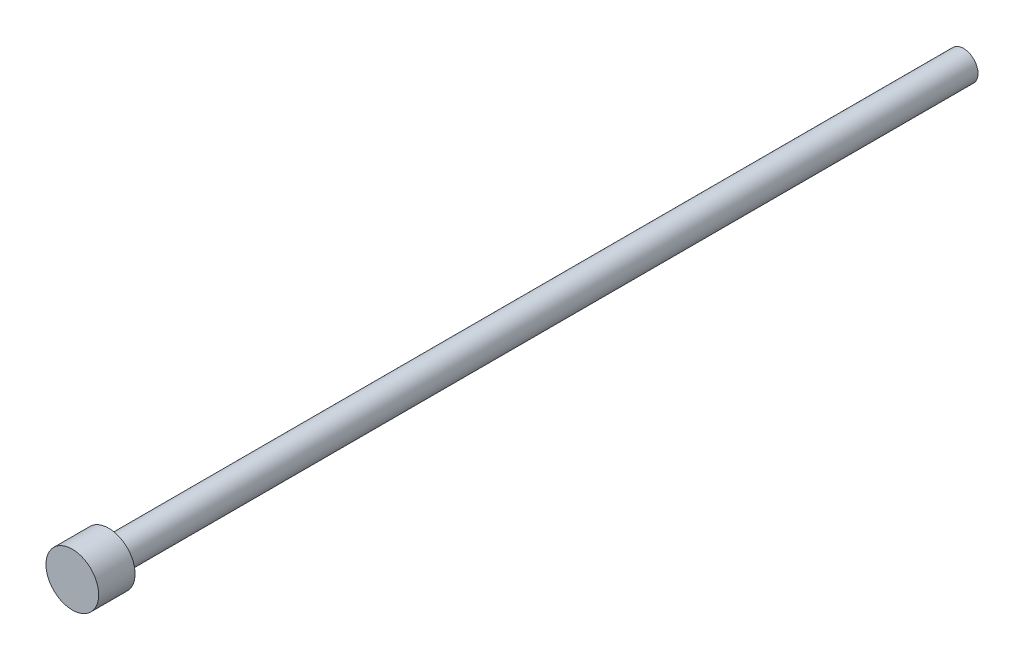
ISO-10303-21;
HEADER;
FILE_DESCRIPTION(('STEP AP214'),'2;1');
FILE_NAME('part.step','',(''),(''),'','','');
FILE_SCHEMA(('AUTOMOTIVE_DESIGN { 1 0 10303 214 1 1 1 1 }'));
ENDSEC;
DATA;
#1=APPLICATION_CONTEXT('core data for automotive mechanical design processes');
#2=APPLICATION_PROTOCOL_DEFINITION('international standard','automotive_design',2000,#1);
#3=PRODUCT_CONTEXT('',#1,'mechanical');
#4=PRODUCT('Part','Part','',(#3));
#5=PRODUCT_RELATED_PRODUCT_CATEGORY('part','',(#4));
#6=PRODUCT_DEFINITION_FORMATION('','',#4);
#7=PRODUCT_DEFINITION_CONTEXT('part definition',#1,'design');
#8=PRODUCT_DEFINITION('design','',#6,#7);
#9=PRODUCT_DEFINITION_SHAPE('','',#8);
#10=(LENGTH_UNIT() NAMED_UNIT(*) SI_UNIT(.MILLI.,.METRE.));
#11=(NAMED_UNIT(*) PLANE_ANGLE_UNIT() SI_UNIT($,.RADIAN.));
#12=(NAMED_UNIT(*) SI_UNIT($,.STERADIAN.) SOLID_ANGLE_UNIT());
#13=UNCERTAINTY_MEASURE_WITH_UNIT(LENGTH_MEASURE(1.E-05),#10,'distance_accuracy_value','');
#14=(GEOMETRIC_REPRESENTATION_CONTEXT(3) GLOBAL_UNCERTAINTY_ASSIGNED_CONTEXT((#13)) GLOBAL_UNIT_ASSIGNED_CONTEXT((#10,
#11,#12)) REPRESENTATION_CONTEXT('',''));
#15=CARTESIAN_POINT('',(0.,0.,0.));
#16=DIRECTION('',(0.,0.,1.));
#17=DIRECTION('',(1.,0.,0.));
#18=AXIS2_PLACEMENT_3D('',#15,#16,#17);
#19=CARTESIAN_POINT('',(0.,0.,119.38));
#20=DIRECTION('',(0.,0.,-1.));
#21=DIRECTION('',(-1.,0.,0.));
#22=AXIS2_PLACEMENT_3D('',#19,#20,#21);
#23=CYLINDRICAL_SURFACE('',#22,2.03835);
#24=CARTESIAN_POINT('',(0.,0.,119.38));
#25=DIRECTION('',(0.,0.,1.));
#26=DIRECTION('',(1.,0.,0.));
#27=AXIS2_PLACEMENT_3D('',#24,#25,#26);
#28=CIRCLE('',#27,2.03835);
#29=CARTESIAN_POINT('',(-2.03835,0.,119.38));
#30=VERTEX_POINT('',#29);
#31=EDGE_CURVE('E10',#30,#30,#28,.T.);
#32=CARTESIAN_POINT('',(0.,0.,0.));
#33=DIRECTION('',(0.,0.,1.));
#34=DIRECTION('',(1.,0.,0.));
#35=AXIS2_PLACEMENT_3D('',#32,#33,#34);
#36=CIRCLE('',#35,2.03835);
#37=CARTESIAN_POINT('',(-2.03835,0.,0.));
#38=VERTEX_POINT('',#37);
#39=EDGE_CURVE('E38',#38,#38,#36,.T.);
#40=CARTESIAN_POINT('',(-2.03835,0.,119.38));
#41=CARTESIAN_POINT('',(-2.03835,0.,118.136458333333));
#42=CARTESIAN_POINT('',(-2.03835,0.,116.892916666667));
#43=CARTESIAN_POINT('',(-2.03835,0.,114.405833333333));
#44=CARTESIAN_POINT('',(-2.03835,0.,113.162291666667));
#45=CARTESIAN_POINT('',(-2.03835,0.,110.675208333333));
#46=CARTESIAN_POINT('',(-2.03835,0.,109.431666666667));
#47=CARTESIAN_POINT('',(-2.03835,0.,106.944583333333));
#48=CARTESIAN_POINT('',(-2.03835,0.,105.701041666667));
#49=CARTESIAN_POINT('',(-2.03835,0.,103.213958333333));
#50=CARTESIAN_POINT('',(-2.03835,0.,101.970416666667));
#51=CARTESIAN_POINT('',(-2.03835,0.,99.4833333333333));
#52=CARTESIAN_POINT('',(-2.03835,0.,98.2397916666667));
#53=CARTESIAN_POINT('',(-2.03835,0.,95.7527083333333));
#54=CARTESIAN_POINT('',(-2.03835,0.,94.5091666666667));
#55=CARTESIAN_POINT('',(-2.03835,0.,92.0220833333333));
#56=CARTESIAN_POINT('',(-2.03835,0.,90.7785416666667));
#57=CARTESIAN_POINT('',(-2.03835,0.,88.2914583333333));
#58=CARTESIAN_POINT('',(-2.03835,0.,87.0479166666667));
#59=CARTESIAN_POINT('',(-2.03835,0.,84.5608333333333));
#60=CARTESIAN_POINT('',(-2.03835,0.,83.3172916666667));
#61=CARTESIAN_POINT('',(-2.03835,0.,80.8302083333333));
#62=CARTESIAN_POINT('',(-2.03835,0.,79.5866666666667));
#63=CARTESIAN_POINT('',(-2.03835,0.,77.0995833333333));
#64=CARTESIAN_POINT('',(-2.03835,0.,75.8560416666667));
#65=CARTESIAN_POINT('',(-2.03835,0.,73.3689583333333));
#66=CARTESIAN_POINT('',(-2.03835,0.,72.1254166666667));
#67=CARTESIAN_POINT('',(-2.03835,0.,69.6383333333333));
#68=CARTESIAN_POINT('',(-2.03835,0.,68.3947916666667));
#69=CARTESIAN_POINT('',(-2.03835,0.,65.9077083333333));
#70=CARTESIAN_POINT('',(-2.03835,0.,64.6641666666667));
#71=CARTESIAN_POINT('',(-2.03835,0.,62.1770833333333));
#72=CARTESIAN_POINT('',(-2.03835,0.,60.9335416666667));
#73=CARTESIAN_POINT('',(-2.03835,0.,58.4464583333333));
#74=CARTESIAN_POINT('',(-2.03835,0.,57.2029166666667));
#75=CARTESIAN_POINT('',(-2.03835,0.,54.7158333333333));
#76=CARTESIAN_POINT('',(-2.03835,0.,53.4722916666667));
#77=CARTESIAN_POINT('',(-2.03835,0.,50.9852083333333));
#78=CARTESIAN_POINT('',(-2.03835,0.,49.7416666666667));
#79=CARTESIAN_POINT('',(-2.03835,0.,47.2545833333333));
#80=CARTESIAN_POINT('',(-2.03835,0.,46.0110416666667));
#81=CARTESIAN_POINT('',(-2.03835,0.,43.5239583333333));
#82=CARTESIAN_POINT('',(-2.03835,0.,42.2804166666667));
#83=CARTESIAN_POINT('',(-2.03835,0.,39.7933333333333));
#84=CARTESIAN_POINT('',(-2.03835,0.,38.5497916666667));
#85=CARTESIAN_POINT('',(-2.03835,0.,36.0627083333333));
#86=CARTESIAN_POINT('',(-2.03835,0.,34.8191666666667));
#87=CARTESIAN_POINT('',(-2.03835,0.,32.3320833333333));
#88=CARTESIAN_POINT('',(-2.03835,0.,31.0885416666667));
#89=CARTESIAN_POINT('',(-2.03835,0.,28.6014583333333));
#90=CARTESIAN_POINT('',(-2.03835,0.,27.3579166666667));
#91=CARTESIAN_POINT('',(-2.03835,0.,24.8708333333333));
#92=CARTESIAN_POINT('',(-2.03835,0.,23.6272916666667));
#93=CARTESIAN_POINT('',(-2.03835,0.,21.1402083333333));
#94=CARTESIAN_POINT('',(-2.03835,0.,19.8966666666667));
#95=CARTESIAN_POINT('',(-2.03835,0.,17.4095833333333));
#96=CARTESIAN_POINT('',(-2.03835,0.,16.1660416666667));
#97=CARTESIAN_POINT('',(-2.03835,0.,13.6789583333333));
#98=CARTESIAN_POINT('',(-2.03835,0.,12.4354166666667));
#99=CARTESIAN_POINT('',(-2.03835,0.,9.94833333333334));
#100=CARTESIAN_POINT('',(-2.03835,0.,8.70479166666667));
#101=CARTESIAN_POINT('',(-2.03835,0.,6.21770833333334));
#102=CARTESIAN_POINT('',(-2.03835,0.,4.97416666666667));
#103=CARTESIAN_POINT('',(-2.03835,0.,2.48708333333333));
#104=CARTESIAN_POINT('',(-2.03835,0.,1.24354166666667));
#105=CARTESIAN_POINT('',(-2.03835,0.,0.));
#106=B_SPLINE_CURVE_WITH_KNOTS('',3,(#40,#41,#42,#43,#44,#45,#46,#47,#48,#49,#50,#51,#52,#53,
#54,#55,#56,#57,#58,#59,#60,#61,#62,#63,#64,#65,#66,#67,#68,#69,#70,#71,#72,#73,#74,#75,#76,#77,
#78,#79,#80,#81,#82,#83,#84,#85,#86,#87,#88,#89,#90,#91,#92,#93,#94,#95,#96,#97,#98,#99,#100,
#101,#102,#103,#104,#105),.UNSPECIFIED.,.F.,.F.,(4,2,2,2,2,2,2,2,2,2,2,2,2,2,2,2,2,2,2,2,2,2,2,
2,2,2,2,2,2,2,2,2,4),(0.,3.73062499999999,7.46124999999999,11.191875,14.9225,18.653125,22.38375,
26.114375,29.845,33.575625,37.30625,41.036875,44.7675,48.498125,52.22875,55.959375,59.69,
63.420625,67.15125,70.881875,74.6125,78.343125,82.07375,85.804375,89.535,93.265625,96.99625,
100.726875,104.4575,108.188125,111.91875,115.649375,119.38),.UNSPECIFIED.);
#107=EDGE_CURVE('BSEAM35',#30,#38,#106,.T.);
#108=ORIENTED_EDGE('',*,*,#31,.F.);
#109=ORIENTED_EDGE('',*,*,#39,.T.);
#110=ORIENTED_EDGE('',*,*,#107,.T.);
#111=ORIENTED_EDGE('',*,*,#107,.F.);
#112=EDGE_LOOP('',(#108,#110,#109,#111));
#113=FACE_BOUND('',#112,.T.);
#114=ADVANCED_FACE('F35',(#113),#23,.T.);
#115=CARTESIAN_POINT('',(0.,0.,0.));
#116=DIRECTION('',(0.,0.,1.));
#117=DIRECTION('',(1.,0.,0.));
#118=AXIS2_PLACEMENT_3D('',#115,#116,#117);
#119=PLANE('',#118);
#120=ORIENTED_EDGE('',*,*,#39,.F.);
#121=EDGE_LOOP('',(#120));
#122=FACE_BOUND('',#121,.T.);
#123=ADVANCED_FACE('F58',(#122),#119,.F.);
#124=CARTESIAN_POINT('',(0.,0.,124.46));
#125=DIRECTION('',(0.,0.,-1.));
#126=DIRECTION('',(-1.,0.,0.));
#127=AXIS2_PLACEMENT_3D('',#124,#125,#126);
#128=CYLINDRICAL_SURFACE('',#127,3.683);
#129=CARTESIAN_POINT('',(0.,0.,124.46));
#130=DIRECTION('',(0.,0.,1.));
#131=DIRECTION('',(1.,0.,0.));
#132=AXIS2_PLACEMENT_3D('',#129,#130,#131);
#133=CIRCLE('',#132,3.683);
#134=CARTESIAN_POINT('',(3.683,0.,124.46));
#135=VERTEX_POINT('',#134);
#136=EDGE_CURVE('E45',#135,#135,#133,.T.);
#137=ORIENTED_EDGE('',*,*,#136,.F.);
#138=EDGE_LOOP('',(#137));
#139=FACE_BOUND('',#138,.T.);
#140=CARTESIAN_POINT('',(0.,0.,119.38));
#141=DIRECTION('',(0.,0.,1.));
#142=DIRECTION('',(1.,0.,0.));
#143=AXIS2_PLACEMENT_3D('',#140,#141,#142);
#144=CIRCLE('',#143,3.683);
#145=CARTESIAN_POINT('',(3.683,0.,119.38));
#146=VERTEX_POINT('',#145);
#147=EDGE_CURVE('E47',#146,#146,#144,.T.);
#148=ORIENTED_EDGE('',*,*,#147,.T.);
#149=EDGE_LOOP('',(#148));
#150=FACE_BOUND('',#149,.T.);
#151=ADVANCED_FACE('F55',(#139,#150),#128,.T.);
#152=CARTESIAN_POINT('',(0.,0.,124.46));
#153=DIRECTION('',(0.,0.,1.));
#154=DIRECTION('',(1.,0.,0.));
#155=AXIS2_PLACEMENT_3D('',#152,#153,#154);
#156=PLANE('',#155);
#157=ORIENTED_EDGE('',*,*,#136,.T.);
#158=EDGE_LOOP('',(#157));
#159=FACE_BOUND('',#158,.T.);
#160=ADVANCED_FACE('F53',(#159),#156,.T.);
#161=CARTESIAN_POINT('',(0.,0.,119.38));
#162=DIRECTION('',(0.,0.,1.));
#163=DIRECTION('',(1.,0.,0.));
#164=AXIS2_PLACEMENT_3D('',#161,#162,#163);
#165=PLANE('',#164);
#166=ORIENTED_EDGE('',*,*,#31,.T.);
#167=EDGE_LOOP('',(#166));
#168=FACE_BOUND('',#167,.T.);
#169=ORIENTED_EDGE('',*,*,#147,.F.);
#170=EDGE_LOOP('',(#169));
#171=FACE_BOUND('',#170,.T.);
#172=ADVANCED_FACE('F62',(#168,#171),#165,.F.);
#173=CLOSED_SHELL('',(#114,#123,#151,#160,#172));
#174=MANIFOLD_SOLID_BREP('B2',#173);
#175=ADVANCED_BREP_SHAPE_REPRESENTATION('',(#18,#174),#14);
#176=SHAPE_DEFINITION_REPRESENTATION(#9,#175);
ENDSEC;
END-ISO-10303-21;
